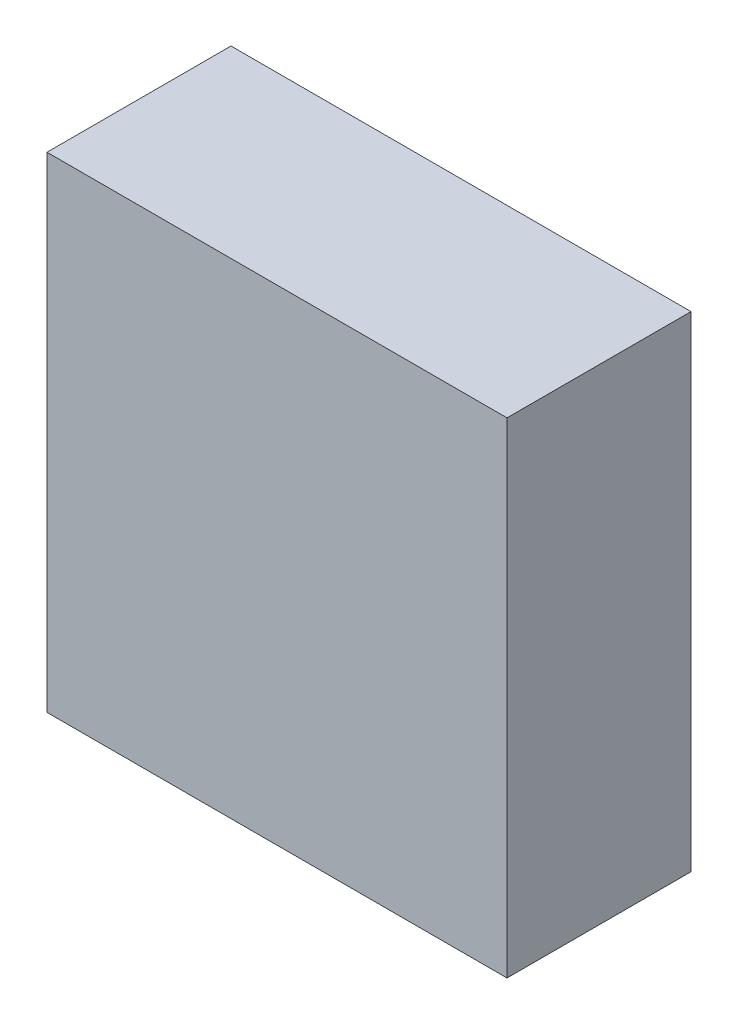
ISO-10303-21;
HEADER;
FILE_DESCRIPTION(('STEP AP214'),'2;1');
FILE_NAME('part.step','',(''),(''),'','','');
FILE_SCHEMA(('AUTOMOTIVE_DESIGN { 1 0 10303 214 1 1 1 1 }'));
ENDSEC;
DATA;
#1=APPLICATION_CONTEXT('core data for automotive mechanical design processes');
#2=APPLICATION_PROTOCOL_DEFINITION('international standard','automotive_design',2000,#1);
#3=PRODUCT_CONTEXT('',#1,'mechanical');
#4=PRODUCT('Part','Part','',(#3));
#5=PRODUCT_RELATED_PRODUCT_CATEGORY('part','',(#4));
#6=PRODUCT_DEFINITION_FORMATION('','',#4);
#7=PRODUCT_DEFINITION_CONTEXT('part definition',#1,'design');
#8=PRODUCT_DEFINITION('design','',#6,#7);
#9=PRODUCT_DEFINITION_SHAPE('','',#8);
#10=(LENGTH_UNIT() NAMED_UNIT(*) SI_UNIT(.MILLI.,.METRE.));
#11=(NAMED_UNIT(*) PLANE_ANGLE_UNIT() SI_UNIT($,.RADIAN.));
#12=(NAMED_UNIT(*) SI_UNIT($,.STERADIAN.) SOLID_ANGLE_UNIT());
#13=UNCERTAINTY_MEASURE_WITH_UNIT(LENGTH_MEASURE(1.E-05),#10,'distance_accuracy_value','');
#14=(GEOMETRIC_REPRESENTATION_CONTEXT(3) GLOBAL_UNCERTAINTY_ASSIGNED_CONTEXT((#13)) GLOBAL_UNIT_ASSIGNED_CONTEXT((#10,
#11,#12)) REPRESENTATION_CONTEXT('',''));
#15=CARTESIAN_POINT('',(0.,0.,0.));
#16=DIRECTION('',(0.,0.,1.));
#17=DIRECTION('',(1.,0.,0.));
#18=AXIS2_PLACEMENT_3D('',#15,#16,#17);
#19=CARTESIAN_POINT('',(0.,0.,0.));
#20=DIRECTION('',(0.,0.,-1.));
#21=DIRECTION('',(-1.,0.,0.));
#22=AXIS2_PLACEMENT_3D('',#19,#20,#21);
#23=PLANE('',#22);
#24=DIRECTION('',(0.,-1.,0.));
#25=VECTOR('',#24,1.);
#26=CARTESIAN_POINT('',(-27.5,-29.,0.));
#27=LINE('',#26,#25);
#28=CARTESIAN_POINT('',(-27.5,29.,0.));
#29=VERTEX_POINT('',#28);
#30=CARTESIAN_POINT('',(-27.5,-29.,0.));
#31=VERTEX_POINT('',#30);
#32=EDGE_CURVE('E141',#29,#31,#27,.T.);
#33=ORIENTED_EDGE('',*,*,#32,.F.);
#34=DIRECTION('',(-1.,0.,0.));
#35=VECTOR('',#34,1.);
#36=CARTESIAN_POINT('',(-27.5,29.,0.));
#37=LINE('',#36,#35);
#38=CARTESIAN_POINT('',(27.5,29.,0.));
#39=VERTEX_POINT('',#38);
#40=EDGE_CURVE('E93',#39,#29,#37,.T.);
#41=ORIENTED_EDGE('',*,*,#40,.F.);
#42=DIRECTION('',(0.,1.,0.));
#43=VECTOR('',#42,1.);
#44=CARTESIAN_POINT('',(27.5,-29.,0.));
#45=LINE('',#44,#43);
#46=CARTESIAN_POINT('',(27.5,-29.,0.));
#47=VERTEX_POINT('',#46);
#48=EDGE_CURVE('E169',#47,#39,#45,.T.);
#49=ORIENTED_EDGE('',*,*,#48,.F.);
#50=DIRECTION('',(1.,0.,0.));
#51=VECTOR('',#50,1.);
#52=CARTESIAN_POINT('',(-27.5,-29.,0.));
#53=LINE('',#52,#51);
#54=EDGE_CURVE('E149',#31,#47,#53,.T.);
#55=ORIENTED_EDGE('',*,*,#54,.F.);
#56=EDGE_LOOP('',(#33,#41,#49,#55));
#57=FACE_BOUND('',#56,.T.);
#58=DIRECTION('',(-1.,0.,0.));
#59=VECTOR('',#58,1.);
#60=CARTESIAN_POINT('',(-25.5,27.,0.));
#61=LINE('',#60,#59);
#62=CARTESIAN_POINT('',(25.5,27.,0.));
#63=VERTEX_POINT('',#62);
#64=CARTESIAN_POINT('',(-25.5,27.,0.));
#65=VERTEX_POINT('',#64);
#66=EDGE_CURVE('E140',#63,#65,#61,.T.);
#67=ORIENTED_EDGE('',*,*,#66,.T.);
#68=DIRECTION('',(0.,-1.,0.));
#69=VECTOR('',#68,1.);
#70=CARTESIAN_POINT('',(-25.5,-27.,0.));
#71=LINE('',#70,#69);
#72=CARTESIAN_POINT('',(-25.5,-27.,0.));
#73=VERTEX_POINT('',#72);
#74=EDGE_CURVE('E62',#65,#73,#71,.T.);
#75=ORIENTED_EDGE('',*,*,#74,.T.);
#76=DIRECTION('',(1.,0.,0.));
#77=VECTOR('',#76,1.);
#78=CARTESIAN_POINT('',(-25.5,-27.,0.));
#79=LINE('',#78,#77);
#80=CARTESIAN_POINT('',(25.5,-27.,0.));
#81=VERTEX_POINT('',#80);
#82=EDGE_CURVE('E143',#73,#81,#79,.T.);
#83=ORIENTED_EDGE('',*,*,#82,.T.);
#84=DIRECTION('',(0.,1.,0.));
#85=VECTOR('',#84,1.);
#86=CARTESIAN_POINT('',(25.5,-27.,0.));
#87=LINE('',#86,#85);
#88=EDGE_CURVE('E288',#81,#63,#87,.T.);
#89=ORIENTED_EDGE('',*,*,#88,.T.);
#90=EDGE_LOOP('',(#67,#75,#83,#89));
#91=FACE_BOUND('',#90,.T.);
#92=ADVANCED_FACE('F44',(#57,#91),#23,.T.);
#93=CARTESIAN_POINT('',(-27.5,-29.,22.));
#94=DIRECTION('',(1.,0.,0.));
#95=DIRECTION('',(0.,0.,-1.));
#96=AXIS2_PLACEMENT_3D('',#93,#94,#95);
#97=PLANE('',#96);
#98=ORIENTED_EDGE('',*,*,#32,.T.);
#99=DIRECTION('',(0.,0.,-1.));
#100=VECTOR('',#99,1.);
#101=CARTESIAN_POINT('',(-27.5,-29.,22.));
#102=LINE('',#101,#100);
#103=CARTESIAN_POINT('',(-27.5,-29.,22.));
#104=VERTEX_POINT('',#103);
#105=EDGE_CURVE('E11',#104,#31,#102,.T.);
#106=ORIENTED_EDGE('',*,*,#105,.F.);
#107=DIRECTION('',(0.,-1.,0.));
#108=VECTOR('',#107,1.);
#109=CARTESIAN_POINT('',(-27.5,-29.,22.));
#110=LINE('',#109,#108);
#111=CARTESIAN_POINT('',(-27.5,29.,22.));
#112=VERTEX_POINT('',#111);
#113=EDGE_CURVE('E154',#112,#104,#110,.T.);
#114=ORIENTED_EDGE('',*,*,#113,.F.);
#115=DIRECTION('',(0.,0.,-1.));
#116=VECTOR('',#115,1.);
#117=CARTESIAN_POINT('',(-27.5,29.,22.));
#118=LINE('',#117,#116);
#119=EDGE_CURVE('E163',#112,#29,#118,.T.);
#120=ORIENTED_EDGE('',*,*,#119,.T.);
#121=EDGE_LOOP('',(#98,#106,#114,#120));
#122=FACE_BOUND('',#121,.T.);
#123=ADVANCED_FACE('F50',(#122),#97,.F.);
#124=CARTESIAN_POINT('',(-27.5,-29.,22.));
#125=DIRECTION('',(0.,1.,0.));
#126=DIRECTION('',(0.,0.,1.));
#127=AXIS2_PLACEMENT_3D('',#124,#125,#126);
#128=PLANE('',#127);
#129=ORIENTED_EDGE('',*,*,#54,.T.);
#130=DIRECTION('',(0.,0.,-1.));
#131=VECTOR('',#130,1.);
#132=CARTESIAN_POINT('',(27.5,-29.,22.));
#133=LINE('',#132,#131);
#134=CARTESIAN_POINT('',(27.5,-29.,22.));
#135=VERTEX_POINT('',#134);
#136=EDGE_CURVE('E53',#135,#47,#133,.T.);
#137=ORIENTED_EDGE('',*,*,#136,.F.);
#138=DIRECTION('',(1.,0.,0.));
#139=VECTOR('',#138,1.);
#140=CARTESIAN_POINT('',(-27.5,-29.,22.));
#141=LINE('',#140,#139);
#142=EDGE_CURVE('E98',#104,#135,#141,.T.);
#143=ORIENTED_EDGE('',*,*,#142,.F.);
#144=ORIENTED_EDGE('',*,*,#105,.T.);
#145=EDGE_LOOP('',(#129,#137,#143,#144));
#146=FACE_BOUND('',#145,.T.);
#147=ADVANCED_FACE('F200',(#146),#128,.F.);
#148=CARTESIAN_POINT('',(27.5,-29.,22.));
#149=DIRECTION('',(-1.,0.,0.));
#150=DIRECTION('',(0.,0.,1.));
#151=AXIS2_PLACEMENT_3D('',#148,#149,#150);
#152=PLANE('',#151);
#153=ORIENTED_EDGE('',*,*,#48,.T.);
#154=DIRECTION('',(0.,0.,-1.));
#155=VECTOR('',#154,1.);
#156=CARTESIAN_POINT('',(27.5,29.,22.));
#157=LINE('',#156,#155);
#158=CARTESIAN_POINT('',(27.5,29.,22.));
#159=VERTEX_POINT('',#158);
#160=EDGE_CURVE('E173',#159,#39,#157,.T.);
#161=ORIENTED_EDGE('',*,*,#160,.F.);
#162=DIRECTION('',(0.,1.,0.));
#163=VECTOR('',#162,1.);
#164=CARTESIAN_POINT('',(27.5,-29.,22.));
#165=LINE('',#164,#163);
#166=EDGE_CURVE('E159',#135,#159,#165,.T.);
#167=ORIENTED_EDGE('',*,*,#166,.F.);
#168=ORIENTED_EDGE('',*,*,#136,.T.);
#169=EDGE_LOOP('',(#153,#161,#167,#168));
#170=FACE_BOUND('',#169,.T.);
#171=ADVANCED_FACE('F185',(#170),#152,.F.);
#172=CARTESIAN_POINT('',(-27.5,29.,22.));
#173=DIRECTION('',(0.,-1.,0.));
#174=DIRECTION('',(0.,0.,-1.));
#175=AXIS2_PLACEMENT_3D('',#172,#173,#174);
#176=PLANE('',#175);
#177=ORIENTED_EDGE('',*,*,#40,.T.);
#178=ORIENTED_EDGE('',*,*,#119,.F.);
#179=DIRECTION('',(-1.,0.,0.));
#180=VECTOR('',#179,1.);
#181=CARTESIAN_POINT('',(-27.5,29.,22.));
#182=LINE('',#181,#180);
#183=EDGE_CURVE('E69',#159,#112,#182,.T.);
#184=ORIENTED_EDGE('',*,*,#183,.F.);
#185=ORIENTED_EDGE('',*,*,#160,.T.);
#186=EDGE_LOOP('',(#177,#178,#184,#185));
#187=FACE_BOUND('',#186,.T.);
#188=ADVANCED_FACE('F188',(#187),#176,.F.);
#189=CARTESIAN_POINT('',(0.,0.,22.));
#190=DIRECTION('',(0.,0.,-1.));
#191=DIRECTION('',(-1.,0.,0.));
#192=AXIS2_PLACEMENT_3D('',#189,#190,#191);
#193=PLANE('',#192);
#194=ORIENTED_EDGE('',*,*,#113,.T.);
#195=ORIENTED_EDGE('',*,*,#142,.T.);
#196=ORIENTED_EDGE('',*,*,#166,.T.);
#197=ORIENTED_EDGE('',*,*,#183,.T.);
#198=EDGE_LOOP('',(#194,#195,#196,#197));
#199=FACE_BOUND('',#198,.T.);
#200=ADVANCED_FACE('F195',(#199),#193,.F.);
#201=CARTESIAN_POINT('',(-25.5,-27.,20.));
#202=DIRECTION('',(1.,0.,0.));
#203=DIRECTION('',(0.,0.,-1.));
#204=AXIS2_PLACEMENT_3D('',#201,#202,#203);
#205=PLANE('',#204);
#206=ORIENTED_EDGE('',*,*,#74,.F.);
#207=DIRECTION('',(0.,0.,-1.));
#208=VECTOR('',#207,1.);
#209=CARTESIAN_POINT('',(-25.5,27.,20.));
#210=LINE('',#209,#208);
#211=CARTESIAN_POINT('',(-25.5,27.,20.));
#212=VERTEX_POINT('',#211);
#213=EDGE_CURVE('E133',#212,#65,#210,.T.);
#214=ORIENTED_EDGE('',*,*,#213,.F.);
#215=DIRECTION('',(0.,-1.,0.));
#216=VECTOR('',#215,1.);
#217=CARTESIAN_POINT('',(-25.5,-27.,20.));
#218=LINE('',#217,#216);
#219=CARTESIAN_POINT('',(-25.5,-27.,20.));
#220=VERTEX_POINT('',#219);
#221=EDGE_CURVE('E127',#212,#220,#218,.T.);
#222=ORIENTED_EDGE('',*,*,#221,.T.);
#223=DIRECTION('',(0.,0.,-1.));
#224=VECTOR('',#223,1.);
#225=CARTESIAN_POINT('',(-25.5,-27.,20.));
#226=LINE('',#225,#224);
#227=EDGE_CURVE('E131',#220,#73,#226,.T.);
#228=ORIENTED_EDGE('',*,*,#227,.T.);
#229=EDGE_LOOP('',(#206,#214,#222,#228));
#230=FACE_BOUND('',#229,.T.);
#231=ADVANCED_FACE('F134',(#230),#205,.T.);
#232=CARTESIAN_POINT('',(-25.5,-27.,20.));
#233=DIRECTION('',(0.,1.,0.));
#234=DIRECTION('',(0.,0.,1.));
#235=AXIS2_PLACEMENT_3D('',#232,#233,#234);
#236=PLANE('',#235);
#237=ORIENTED_EDGE('',*,*,#82,.F.);
#238=ORIENTED_EDGE('',*,*,#227,.F.);
#239=DIRECTION('',(1.,0.,0.));
#240=VECTOR('',#239,1.);
#241=CARTESIAN_POINT('',(-25.5,-27.,20.));
#242=LINE('',#241,#240);
#243=CARTESIAN_POINT('',(25.5,-27.,20.));
#244=VERTEX_POINT('',#243);
#245=EDGE_CURVE('E125',#220,#244,#242,.T.);
#246=ORIENTED_EDGE('',*,*,#245,.T.);
#247=DIRECTION('',(0.,0.,-1.));
#248=VECTOR('',#247,1.);
#249=CARTESIAN_POINT('',(25.5,-27.,20.));
#250=LINE('',#249,#248);
#251=EDGE_CURVE('E145',#244,#81,#250,.T.);
#252=ORIENTED_EDGE('',*,*,#251,.T.);
#253=EDGE_LOOP('',(#237,#238,#246,#252));
#254=FACE_BOUND('',#253,.T.);
#255=ADVANCED_FACE('F137',(#254),#236,.T.);
#256=CARTESIAN_POINT('',(25.5,-27.,20.));
#257=DIRECTION('',(-1.,0.,0.));
#258=DIRECTION('',(0.,0.,1.));
#259=AXIS2_PLACEMENT_3D('',#256,#257,#258);
#260=PLANE('',#259);
#261=ORIENTED_EDGE('',*,*,#88,.F.);
#262=ORIENTED_EDGE('',*,*,#251,.F.);
#263=DIRECTION('',(0.,1.,0.));
#264=VECTOR('',#263,1.);
#265=CARTESIAN_POINT('',(25.5,-27.,20.));
#266=LINE('',#265,#264);
#267=CARTESIAN_POINT('',(25.5,27.,20.));
#268=VERTEX_POINT('',#267);
#269=EDGE_CURVE('E130',#244,#268,#266,.T.);
#270=ORIENTED_EDGE('',*,*,#269,.T.);
#271=DIRECTION('',(0.,0.,-1.));
#272=VECTOR('',#271,1.);
#273=CARTESIAN_POINT('',(25.5,27.,20.));
#274=LINE('',#273,#272);
#275=EDGE_CURVE('E151',#268,#63,#274,.T.);
#276=ORIENTED_EDGE('',*,*,#275,.T.);
#277=EDGE_LOOP('',(#261,#262,#270,#276));
#278=FACE_BOUND('',#277,.T.);
#279=ADVANCED_FACE('F211',(#278),#260,.T.);
#280=CARTESIAN_POINT('',(-25.5,27.,20.));
#281=DIRECTION('',(0.,-1.,0.));
#282=DIRECTION('',(0.,0.,-1.));
#283=AXIS2_PLACEMENT_3D('',#280,#281,#282);
#284=PLANE('',#283);
#285=ORIENTED_EDGE('',*,*,#66,.F.);
#286=ORIENTED_EDGE('',*,*,#275,.F.);
#287=DIRECTION('',(-1.,0.,0.));
#288=VECTOR('',#287,1.);
#289=CARTESIAN_POINT('',(-25.5,27.,20.));
#290=LINE('',#289,#288);
#291=EDGE_CURVE('E299',#268,#212,#290,.T.);
#292=ORIENTED_EDGE('',*,*,#291,.T.);
#293=ORIENTED_EDGE('',*,*,#213,.T.);
#294=EDGE_LOOP('',(#285,#286,#292,#293));
#295=FACE_BOUND('',#294,.T.);
#296=ADVANCED_FACE('F212',(#295),#284,.T.);
#297=CARTESIAN_POINT('',(0.,0.,20.));
#298=DIRECTION('',(0.,0.,-1.));
#299=DIRECTION('',(-1.,0.,0.));
#300=AXIS2_PLACEMENT_3D('',#297,#298,#299);
#301=PLANE('',#300);
#302=ORIENTED_EDGE('',*,*,#221,.F.);
#303=ORIENTED_EDGE('',*,*,#291,.F.);
#304=ORIENTED_EDGE('',*,*,#269,.F.);
#305=ORIENTED_EDGE('',*,*,#245,.F.);
#306=EDGE_LOOP('',(#302,#303,#304,#305));
#307=FACE_BOUND('',#306,.T.);
#308=ADVANCED_FACE('F122',(#307),#301,.T.);
#309=CLOSED_SHELL('',(#92,#123,#147,#171,#188,#200,#231,#255,#279,#296,#308));
#310=MANIFOLD_SOLID_BREP('B2',#309);
#311=ADVANCED_BREP_SHAPE_REPRESENTATION('',(#18,#310),#14);
#312=SHAPE_DEFINITION_REPRESENTATION(#9,#311);
ENDSEC;
END-ISO-10303-21;
